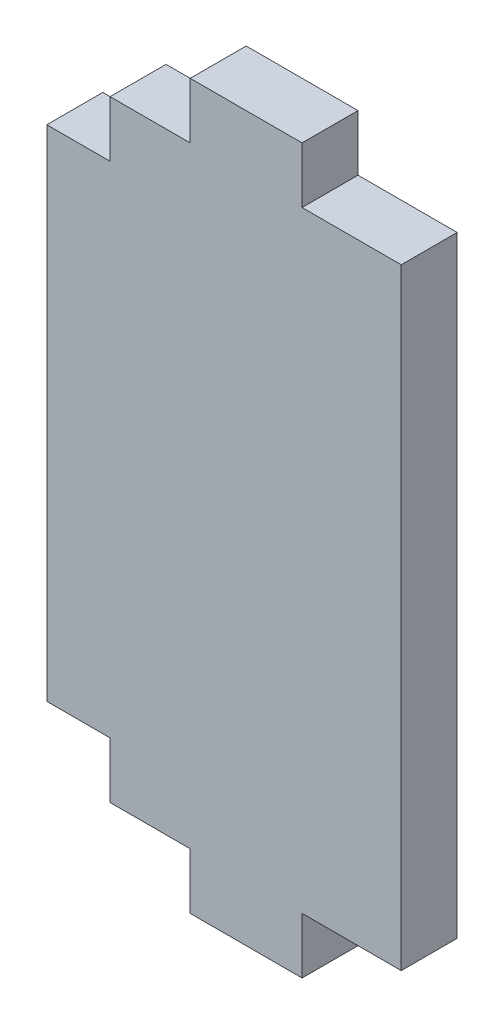
ISO-10303-21;
HEADER;
FILE_DESCRIPTION(('STEP AP214'),'2;1');
FILE_NAME('part.step','',(''),(''),'','','');
FILE_SCHEMA(('AUTOMOTIVE_DESIGN { 1 0 10303 214 1 1 1 1 }'));
ENDSEC;
DATA;
#1=APPLICATION_CONTEXT('core data for automotive mechanical design processes');
#2=APPLICATION_PROTOCOL_DEFINITION('international standard','automotive_design',2000,#1);
#3=PRODUCT_CONTEXT('',#1,'mechanical');
#4=PRODUCT('Part','Part','',(#3));
#5=PRODUCT_RELATED_PRODUCT_CATEGORY('part','',(#4));
#6=PRODUCT_DEFINITION_FORMATION('','',#4);
#7=PRODUCT_DEFINITION_CONTEXT('part definition',#1,'design');
#8=PRODUCT_DEFINITION('design','',#6,#7);
#9=PRODUCT_DEFINITION_SHAPE('','',#8);
#10=(LENGTH_UNIT() NAMED_UNIT(*) SI_UNIT(.MILLI.,.METRE.));
#11=(NAMED_UNIT(*) PLANE_ANGLE_UNIT() SI_UNIT($,.RADIAN.));
#12=(NAMED_UNIT(*) SI_UNIT($,.STERADIAN.) SOLID_ANGLE_UNIT());
#13=UNCERTAINTY_MEASURE_WITH_UNIT(LENGTH_MEASURE(1.E-05),#10,'distance_accuracy_value','');
#14=(GEOMETRIC_REPRESENTATION_CONTEXT(3) GLOBAL_UNCERTAINTY_ASSIGNED_CONTEXT((#13)) GLOBAL_UNIT_ASSIGNED_CONTEXT((#10,
#11,#12)) REPRESENTATION_CONTEXT('',''));
#15=CARTESIAN_POINT('',(0.,0.,0.));
#16=DIRECTION('',(0.,0.,1.));
#17=DIRECTION('',(1.,0.,0.));
#18=AXIS2_PLACEMENT_3D('',#15,#16,#17);
#19=CARTESIAN_POINT('',(-1241.1494371055,-48.5074859939811,3.00000000000005));
#20=DIRECTION('',(0.,-1.,0.));
#21=DIRECTION('',(0.,0.,-1.));
#22=AXIS2_PLACEMENT_3D('',#19,#20,#21);
#23=PLANE('',#22);
#24=DIRECTION('',(-1.,0.,0.));
#25=VECTOR('',#24,1.);
#26=CARTESIAN_POINT('',(-1241.14943710549,-48.5074859939811,1.04083408558608E-13));
#27=LINE('',#26,#25);
#28=CARTESIAN_POINT('',(-1235.83358525909,-48.5074859939811,1.04083408558608E-13));
#29=VERTEX_POINT('',#28);
#30=CARTESIAN_POINT('',(-1241.14943710549,-48.5074859939811,1.04083408558608E-13));
#31=VERTEX_POINT('',#30);
#32=EDGE_CURVE('E148',#29,#31,#27,.T.);
#33=ORIENTED_EDGE('',*,*,#32,.T.);
#34=DIRECTION('',(0.,0.,-1.));
#35=VECTOR('',#34,1.);
#36=CARTESIAN_POINT('',(-1241.1494371055,-48.5074859939811,3.00000000000005));
#37=LINE('',#36,#35);
#38=CARTESIAN_POINT('',(-1241.1494371055,-48.5074859939811,3.00000000000005));
#39=VERTEX_POINT('',#38);
#40=EDGE_CURVE('E11',#39,#31,#37,.T.);
#41=ORIENTED_EDGE('',*,*,#40,.F.);
#42=DIRECTION('',(-1.,0.,0.));
#43=VECTOR('',#42,1.);
#44=CARTESIAN_POINT('',(-1241.1494371055,-48.5074859939811,3.00000000000005));
#45=LINE('',#44,#43);
#46=CARTESIAN_POINT('',(-1235.83358525909,-48.5074859939812,3.0000000000001));
#47=VERTEX_POINT('',#46);
#48=EDGE_CURVE('E191',#47,#39,#45,.T.);
#49=ORIENTED_EDGE('',*,*,#48,.F.);
#50=DIRECTION('',(0.,0.,-1.));
#51=VECTOR('',#50,1.);
#52=CARTESIAN_POINT('',(-1235.83358525909,-48.5074859939812,3.0000000000001));
#53=LINE('',#52,#51);
#54=EDGE_CURVE('E161',#47,#29,#53,.T.);
#55=ORIENTED_EDGE('',*,*,#54,.T.);
#56=EDGE_LOOP('',(#33,#41,#49,#55));
#57=FACE_BOUND('',#56,.T.);
#58=ADVANCED_FACE('F32',(#57),#23,.F.);
#59=CARTESIAN_POINT('',(-1241.14943710549,-45.5074859939811,3.00000000000009));
#60=DIRECTION('',(-1.,0.,0.));
#61=DIRECTION('',(0.,0.,1.));
#62=AXIS2_PLACEMENT_3D('',#59,#60,#61);
#63=PLANE('',#62);
#64=DIRECTION('',(0.,1.,0.));
#65=VECTOR('',#64,1.);
#66=CARTESIAN_POINT('',(-1241.14943710549,-45.5074859939811,0.));
#67=LINE('',#66,#65);
#68=CARTESIAN_POINT('',(-1241.14943710549,-45.5074859939811,0.));
#69=VERTEX_POINT('',#68);
#70=EDGE_CURVE('E144',#31,#69,#67,.T.);
#71=ORIENTED_EDGE('',*,*,#70,.T.);
#72=DIRECTION('',(0.,0.,-1.));
#73=VECTOR('',#72,1.);
#74=CARTESIAN_POINT('',(-1241.14943710549,-45.5074859939811,3.00000000000009));
#75=LINE('',#74,#73);
#76=CARTESIAN_POINT('',(-1241.14943710549,-45.5074859939811,3.00000000000009));
#77=VERTEX_POINT('',#76);
#78=EDGE_CURVE('E39',#77,#69,#75,.T.);
#79=ORIENTED_EDGE('',*,*,#78,.F.);
#80=DIRECTION('',(0.,1.,0.));
#81=VECTOR('',#80,1.);
#82=CARTESIAN_POINT('',(-1241.14943710549,-45.5074859939811,3.00000000000009));
#83=LINE('',#82,#81);
#84=EDGE_CURVE('E157',#39,#77,#83,.T.);
#85=ORIENTED_EDGE('',*,*,#84,.F.);
#86=ORIENTED_EDGE('',*,*,#40,.T.);
#87=EDGE_LOOP('',(#71,#79,#85,#86));
#88=FACE_BOUND('',#87,.T.);
#89=ADVANCED_FACE('F156',(#88),#63,.F.);
#90=CARTESIAN_POINT('',(-1247.1453446838,-45.5074859939812,3.0000000000002));
#91=DIRECTION('',(0.,-1.,0.));
#92=DIRECTION('',(0.,0.,-1.));
#93=AXIS2_PLACEMENT_3D('',#90,#91,#92);
#94=PLANE('',#93);
#95=DIRECTION('',(-1.,0.,0.));
#96=VECTOR('',#95,1.);
#97=CARTESIAN_POINT('',(-1247.1453446838,-45.5074859939811,1.17961196366423E-13));
#98=LINE('',#97,#96);
#99=CARTESIAN_POINT('',(-1247.1453446838,-45.5074859939811,1.17961196366423E-13));
#100=VERTEX_POINT('',#99);
#101=EDGE_CURVE('E150',#69,#100,#98,.T.);
#102=ORIENTED_EDGE('',*,*,#101,.T.);
#103=DIRECTION('',(0.,0.,-1.));
#104=VECTOR('',#103,1.);
#105=CARTESIAN_POINT('',(-1247.1453446838,-45.5074859939812,3.0000000000002));
#106=LINE('',#105,#104);
#107=CARTESIAN_POINT('',(-1247.1453446838,-45.5074859939812,3.0000000000002));
#108=VERTEX_POINT('',#107);
#109=EDGE_CURVE('E257',#108,#100,#106,.T.);
#110=ORIENTED_EDGE('',*,*,#109,.F.);
#111=DIRECTION('',(-1.,0.,0.));
#112=VECTOR('',#111,1.);
#113=CARTESIAN_POINT('',(-1247.1453446838,-45.5074859939812,3.0000000000002));
#114=LINE('',#113,#112);
#115=EDGE_CURVE('E194',#77,#108,#114,.T.);
#116=ORIENTED_EDGE('',*,*,#115,.F.);
#117=ORIENTED_EDGE('',*,*,#78,.T.);
#118=EDGE_LOOP('',(#102,#110,#116,#117));
#119=FACE_BOUND('',#118,.T.);
#120=ADVANCED_FACE('F261',(#119),#94,.F.);
#121=CARTESIAN_POINT('',(-1247.1453446838,-48.5074859939812,3.00000000000015));
#122=DIRECTION('',(1.,0.,0.));
#123=DIRECTION('',(0.,0.,-1.));
#124=AXIS2_PLACEMENT_3D('',#121,#122,#123);
#125=PLANE('',#124);
#126=DIRECTION('',(0.,-1.,0.));
#127=VECTOR('',#126,1.);
#128=CARTESIAN_POINT('',(-1247.1453446838,-48.5074859939811,1.94289029309402E-13));
#129=LINE('',#128,#127);
#130=CARTESIAN_POINT('',(-1247.1453446838,-48.5074859939811,1.94289029309402E-13));
#131=VERTEX_POINT('',#130);
#132=EDGE_CURVE('E165',#100,#131,#129,.T.);
#133=ORIENTED_EDGE('',*,*,#132,.T.);
#134=DIRECTION('',(0.,0.,-1.));
#135=VECTOR('',#134,1.);
#136=CARTESIAN_POINT('',(-1247.1453446838,-48.5074859939812,3.00000000000015));
#137=LINE('',#136,#135);
#138=CARTESIAN_POINT('',(-1247.1453446838,-48.5074859939812,3.00000000000015));
#139=VERTEX_POINT('',#138);
#140=EDGE_CURVE('E254',#139,#131,#137,.T.);
#141=ORIENTED_EDGE('',*,*,#140,.F.);
#142=DIRECTION('',(0.,-1.,0.));
#143=VECTOR('',#142,1.);
#144=CARTESIAN_POINT('',(-1247.1453446838,-48.5074859939812,3.00000000000015));
#145=LINE('',#144,#143);
#146=EDGE_CURVE('E196',#108,#139,#145,.T.);
#147=ORIENTED_EDGE('',*,*,#146,.F.);
#148=ORIENTED_EDGE('',*,*,#109,.T.);
#149=EDGE_LOOP('',(#133,#141,#147,#148));
#150=FACE_BOUND('',#149,.T.);
#151=ADVANCED_FACE('F269',(#150),#125,.F.);
#152=CARTESIAN_POINT('',(-1251.44188848172,-48.5074859939809,3.00000000000002));
#153=DIRECTION('',(0.,-1.,0.));
#154=DIRECTION('',(0.,0.,-1.));
#155=AXIS2_PLACEMENT_3D('',#152,#153,#154);
#156=PLANE('',#155);
#157=DIRECTION('',(-1.,0.,0.));
#158=VECTOR('',#157,1.);
#159=CARTESIAN_POINT('',(-1251.44188848172,-48.5074859939811,0.));
#160=LINE('',#159,#158);
#161=CARTESIAN_POINT('',(-1251.44188848172,-48.5074859939811,0.));
#162=VERTEX_POINT('',#161);
#163=EDGE_CURVE('E167',#131,#162,#160,.T.);
#164=ORIENTED_EDGE('',*,*,#163,.T.);
#165=DIRECTION('',(0.,0.,-1.));
#166=VECTOR('',#165,1.);
#167=CARTESIAN_POINT('',(-1251.44188848172,-48.5074859939809,3.00000000000002));
#168=LINE('',#167,#166);
#169=CARTESIAN_POINT('',(-1251.44188848172,-48.5074859939809,3.00000000000002));
#170=VERTEX_POINT('',#169);
#171=EDGE_CURVE('E251',#170,#162,#168,.T.);
#172=ORIENTED_EDGE('',*,*,#171,.F.);
#173=DIRECTION('',(-1.,0.,0.));
#174=VECTOR('',#173,1.);
#175=CARTESIAN_POINT('',(-1251.44188848172,-48.5074859939809,3.00000000000002));
#176=LINE('',#175,#174);
#177=EDGE_CURVE('E198',#139,#170,#176,.T.);
#178=ORIENTED_EDGE('',*,*,#177,.F.);
#179=ORIENTED_EDGE('',*,*,#140,.T.);
#180=EDGE_LOOP('',(#164,#172,#178,#179));
#181=FACE_BOUND('',#180,.T.);
#182=ADVANCED_FACE('F272',(#181),#156,.F.);
#183=CARTESIAN_POINT('',(-1251.44188848172,-51.5074859939809,2.99999999999998));
#184=DIRECTION('',(1.,0.,0.));
#185=DIRECTION('',(0.,0.,-1.));
#186=AXIS2_PLACEMENT_3D('',#183,#184,#185);
#187=PLANE('',#186);
#188=DIRECTION('',(0.,-1.,0.));
#189=VECTOR('',#188,1.);
#190=CARTESIAN_POINT('',(-1251.44188848172,-51.5074859939811,0.));
#191=LINE('',#190,#189);
#192=CARTESIAN_POINT('',(-1251.44188848172,-51.5074859939811,0.));
#193=VERTEX_POINT('',#192);
#194=EDGE_CURVE('E169',#162,#193,#191,.T.);
#195=ORIENTED_EDGE('',*,*,#194,.T.);
#196=DIRECTION('',(0.,0.,-1.));
#197=VECTOR('',#196,1.);
#198=CARTESIAN_POINT('',(-1251.44188848172,-51.5074859939809,2.99999999999998));
#199=LINE('',#198,#197);
#200=CARTESIAN_POINT('',(-1251.44188848172,-51.5074859939809,2.99999999999998));
#201=VERTEX_POINT('',#200);
#202=EDGE_CURVE('E248',#201,#193,#199,.T.);
#203=ORIENTED_EDGE('',*,*,#202,.F.);
#204=DIRECTION('',(0.,-1.,0.));
#205=VECTOR('',#204,1.);
#206=CARTESIAN_POINT('',(-1251.44188848172,-51.5074859939809,2.99999999999998));
#207=LINE('',#206,#205);
#208=EDGE_CURVE('E200',#170,#201,#207,.T.);
#209=ORIENTED_EDGE('',*,*,#208,.F.);
#210=ORIENTED_EDGE('',*,*,#171,.T.);
#211=EDGE_LOOP('',(#195,#203,#209,#210));
#212=FACE_BOUND('',#211,.T.);
#213=ADVANCED_FACE('F277',(#212),#187,.F.);
#214=CARTESIAN_POINT('',(-1254.83358525909,-51.5074859939809,2.99999999999998));
#215=DIRECTION('',(0.,-1.,0.));
#216=DIRECTION('',(0.,0.,-1.));
#217=AXIS2_PLACEMENT_3D('',#214,#215,#216);
#218=PLANE('',#217);
#219=DIRECTION('',(-1.,0.,0.));
#220=VECTOR('',#219,1.);
#221=CARTESIAN_POINT('',(-1254.83358525909,-51.5074859939811,0.));
#222=LINE('',#221,#220);
#223=CARTESIAN_POINT('',(-1254.83358525909,-51.5074859939811,0.));
#224=VERTEX_POINT('',#223);
#225=EDGE_CURVE('E171',#193,#224,#222,.T.);
#226=ORIENTED_EDGE('',*,*,#225,.T.);
#227=DIRECTION('',(0.,0.,-1.));
#228=VECTOR('',#227,1.);
#229=CARTESIAN_POINT('',(-1254.83358525909,-51.5074859939809,2.99999999999998));
#230=LINE('',#229,#228);
#231=CARTESIAN_POINT('',(-1254.83358525909,-51.5074859939809,2.99999999999998));
#232=VERTEX_POINT('',#231);
#233=EDGE_CURVE('E245',#232,#224,#230,.T.);
#234=ORIENTED_EDGE('',*,*,#233,.F.);
#235=DIRECTION('',(-1.,0.,0.));
#236=VECTOR('',#235,1.);
#237=CARTESIAN_POINT('',(-1254.83358525909,-51.5074859939809,2.99999999999998));
#238=LINE('',#237,#236);
#239=EDGE_CURVE('E202',#201,#232,#238,.T.);
#240=ORIENTED_EDGE('',*,*,#239,.F.);
#241=ORIENTED_EDGE('',*,*,#202,.T.);
#242=EDGE_LOOP('',(#226,#234,#240,#241));
#243=FACE_BOUND('',#242,.T.);
#244=ADVANCED_FACE('F283',(#243),#218,.F.);
#245=CARTESIAN_POINT('',(-1254.83358525909,-78.2774859939809,2.99999999999999));
#246=DIRECTION('',(1.,0.,0.));
#247=DIRECTION('',(0.,0.,-1.));
#248=AXIS2_PLACEMENT_3D('',#245,#246,#247);
#249=PLANE('',#248);
#250=DIRECTION('',(0.,-1.,0.));
#251=VECTOR('',#250,1.);
#252=CARTESIAN_POINT('',(-1254.83358525909,-78.2774859939811,0.));
#253=LINE('',#252,#251);
#254=CARTESIAN_POINT('',(-1254.83358525909,-78.2774859939811,0.));
#255=VERTEX_POINT('',#254);
#256=EDGE_CURVE('E173',#224,#255,#253,.T.);
#257=ORIENTED_EDGE('',*,*,#256,.T.);
#258=DIRECTION('',(0.,0.,-1.));
#259=VECTOR('',#258,1.);
#260=CARTESIAN_POINT('',(-1254.83358525909,-78.2774859939809,2.99999999999999));
#261=LINE('',#260,#259);
#262=CARTESIAN_POINT('',(-1254.83358525909,-78.2774859939809,2.99999999999999));
#263=VERTEX_POINT('',#262);
#264=EDGE_CURVE('E242',#263,#255,#261,.T.);
#265=ORIENTED_EDGE('',*,*,#264,.F.);
#266=DIRECTION('',(0.,-1.,0.));
#267=VECTOR('',#266,1.);
#268=CARTESIAN_POINT('',(-1254.83358525909,-78.2774859939809,2.99999999999999));
#269=LINE('',#268,#267);
#270=EDGE_CURVE('E204',#232,#263,#269,.T.);
#271=ORIENTED_EDGE('',*,*,#270,.F.);
#272=ORIENTED_EDGE('',*,*,#233,.T.);
#273=EDGE_LOOP('',(#257,#265,#271,#272));
#274=FACE_BOUND('',#273,.T.);
#275=ADVANCED_FACE('F287',(#274),#249,.F.);
#276=CARTESIAN_POINT('',(-1254.83358525909,-78.2774859939809,2.99999999999999));
#277=DIRECTION('',(0.,1.,0.));
#278=DIRECTION('',(-1.,0.,0.));
#279=AXIS2_PLACEMENT_3D('',#276,#277,#278);
#280=PLANE('',#279);
#281=DIRECTION('',(1.,0.,0.));
#282=VECTOR('',#281,1.);
#283=CARTESIAN_POINT('',(-1254.83358525909,-78.2774859939811,0.));
#284=LINE('',#283,#282);
#285=CARTESIAN_POINT('',(-1251.44188848172,-78.2774859939811,0.));
#286=VERTEX_POINT('',#285);
#287=EDGE_CURVE('E175',#255,#286,#284,.T.);
#288=ORIENTED_EDGE('',*,*,#287,.T.);
#289=DIRECTION('',(0.,0.,-1.));
#290=VECTOR('',#289,1.);
#291=CARTESIAN_POINT('',(-1251.44188848172,-78.2774859939809,3.));
#292=LINE('',#291,#290);
#293=CARTESIAN_POINT('',(-1251.44188848172,-78.2774859939809,3.));
#294=VERTEX_POINT('',#293);
#295=EDGE_CURVE('E239',#294,#286,#292,.T.);
#296=ORIENTED_EDGE('',*,*,#295,.F.);
#297=DIRECTION('',(1.,0.,0.));
#298=VECTOR('',#297,1.);
#299=CARTESIAN_POINT('',(-1254.83358525909,-78.2774859939809,2.99999999999999));
#300=LINE('',#299,#298);
#301=EDGE_CURVE('E206',#263,#294,#300,.T.);
#302=ORIENTED_EDGE('',*,*,#301,.F.);
#303=ORIENTED_EDGE('',*,*,#264,.T.);
#304=EDGE_LOOP('',(#288,#296,#302,#303));
#305=FACE_BOUND('',#304,.T.);
#306=ADVANCED_FACE('F292',(#305),#280,.F.);
#307=CARTESIAN_POINT('',(-1251.44188848172,-78.2774859939809,3.));
#308=DIRECTION('',(1.,0.,0.));
#309=DIRECTION('',(0.,0.,-1.));
#310=AXIS2_PLACEMENT_3D('',#307,#308,#309);
#311=PLANE('',#310);
#312=DIRECTION('',(0.,-1.,0.));
#313=VECTOR('',#312,1.);
#314=CARTESIAN_POINT('',(-1251.44188848172,-78.2774859939811,0.));
#315=LINE('',#314,#313);
#316=CARTESIAN_POINT('',(-1251.44188848172,-81.277485993981,1.38777878078145E-13));
#317=VERTEX_POINT('',#316);
#318=EDGE_CURVE('E177',#286,#317,#315,.T.);
#319=ORIENTED_EDGE('',*,*,#318,.T.);
#320=DIRECTION('',(0.,0.,-1.));
#321=VECTOR('',#320,1.);
#322=CARTESIAN_POINT('',(-1251.44188848172,-81.2774859939809,3.00000000000002));
#323=LINE('',#322,#321);
#324=CARTESIAN_POINT('',(-1251.44188848172,-81.2774859939809,3.00000000000002));
#325=VERTEX_POINT('',#324);
#326=EDGE_CURVE('E236',#325,#317,#323,.T.);
#327=ORIENTED_EDGE('',*,*,#326,.F.);
#328=DIRECTION('',(0.,-1.,0.));
#329=VECTOR('',#328,1.);
#330=CARTESIAN_POINT('',(-1251.44188848172,-78.2774859939809,3.));
#331=LINE('',#330,#329);
#332=EDGE_CURVE('E208',#294,#325,#331,.T.);
#333=ORIENTED_EDGE('',*,*,#332,.F.);
#334=ORIENTED_EDGE('',*,*,#295,.T.);
#335=EDGE_LOOP('',(#319,#327,#333,#334));
#336=FACE_BOUND('',#335,.T.);
#337=ADVANCED_FACE('F298',(#336),#311,.F.);
#338=CARTESIAN_POINT('',(-1251.44188848172,-81.2774859939809,3.00000000000002));
#339=DIRECTION('',(0.,1.,0.));
#340=DIRECTION('',(0.,0.,1.));
#341=AXIS2_PLACEMENT_3D('',#338,#339,#340);
#342=PLANE('',#341);
#343=DIRECTION('',(1.,0.,0.));
#344=VECTOR('',#343,1.);
#345=CARTESIAN_POINT('',(-1251.44188848172,-81.277485993981,1.38777878078145E-13));
#346=LINE('',#345,#344);
#347=CARTESIAN_POINT('',(-1247.1453446838,-81.2774859939812,2.22044604925031E-13));
#348=VERTEX_POINT('',#347);
#349=EDGE_CURVE('E179',#317,#348,#346,.T.);
#350=ORIENTED_EDGE('',*,*,#349,.T.);
#351=DIRECTION('',(0.,0.,-1.));
#352=VECTOR('',#351,1.);
#353=CARTESIAN_POINT('',(-1247.1453446838,-81.2774859939811,3.00000000000011));
#354=LINE('',#353,#352);
#355=CARTESIAN_POINT('',(-1247.1453446838,-81.2774859939811,3.00000000000011));
#356=VERTEX_POINT('',#355);
#357=EDGE_CURVE('E233',#356,#348,#354,.T.);
#358=ORIENTED_EDGE('',*,*,#357,.F.);
#359=DIRECTION('',(1.,0.,0.));
#360=VECTOR('',#359,1.);
#361=CARTESIAN_POINT('',(-1251.44188848172,-81.2774859939809,3.00000000000002));
#362=LINE('',#361,#360);
#363=EDGE_CURVE('E210',#325,#356,#362,.T.);
#364=ORIENTED_EDGE('',*,*,#363,.F.);
#365=ORIENTED_EDGE('',*,*,#326,.T.);
#366=EDGE_LOOP('',(#350,#358,#364,#365));
#367=FACE_BOUND('',#366,.T.);
#368=ADVANCED_FACE('F302',(#367),#342,.F.);
#369=CARTESIAN_POINT('',(-1247.1453446838,-81.2774859939811,3.00000000000011));
#370=DIRECTION('',(1.,0.,0.));
#371=DIRECTION('',(0.,0.,-1.));
#372=AXIS2_PLACEMENT_3D('',#369,#370,#371);
#373=PLANE('',#372);
#374=DIRECTION('',(0.,-1.,0.));
#375=VECTOR('',#374,1.);
#376=CARTESIAN_POINT('',(-1247.1453446838,-81.2774859939812,2.22044604925031E-13));
#377=LINE('',#376,#375);
#378=CARTESIAN_POINT('',(-1247.1453446838,-84.2774859939812,1.66533453693773E-13));
#379=VERTEX_POINT('',#378);
#380=EDGE_CURVE('E181',#348,#379,#377,.T.);
#381=ORIENTED_EDGE('',*,*,#380,.T.);
#382=DIRECTION('',(0.,0.,-1.));
#383=VECTOR('',#382,1.);
#384=CARTESIAN_POINT('',(-1247.1453446838,-84.2774859939811,3.00000000000013));
#385=LINE('',#384,#383);
#386=CARTESIAN_POINT('',(-1247.1453446838,-84.2774859939811,3.00000000000013));
#387=VERTEX_POINT('',#386);
#388=EDGE_CURVE('E230',#387,#379,#385,.T.);
#389=ORIENTED_EDGE('',*,*,#388,.F.);
#390=DIRECTION('',(0.,-1.,0.));
#391=VECTOR('',#390,1.);
#392=CARTESIAN_POINT('',(-1247.1453446838,-81.2774859939811,3.00000000000011));
#393=LINE('',#392,#391);
#394=EDGE_CURVE('E212',#356,#387,#393,.T.);
#395=ORIENTED_EDGE('',*,*,#394,.F.);
#396=ORIENTED_EDGE('',*,*,#357,.T.);
#397=EDGE_LOOP('',(#381,#389,#395,#396));
#398=FACE_BOUND('',#397,.T.);
#399=ADVANCED_FACE('F307',(#398),#373,.F.);
#400=CARTESIAN_POINT('',(-1247.1453446838,-84.2774859939811,3.00000000000013));
#401=DIRECTION('',(0.,1.,0.));
#402=DIRECTION('',(0.,0.,1.));
#403=AXIS2_PLACEMENT_3D('',#400,#401,#402);
#404=PLANE('',#403);
#405=DIRECTION('',(1.,0.,0.));
#406=VECTOR('',#405,1.);
#407=CARTESIAN_POINT('',(-1247.1453446838,-84.2774859939812,1.66533453693773E-13));
#408=LINE('',#407,#406);
#409=CARTESIAN_POINT('',(-1241.14943710549,-84.2774859939811,1.45716771982052E-13));
#410=VERTEX_POINT('',#409);
#411=EDGE_CURVE('E183',#379,#410,#408,.T.);
#412=ORIENTED_EDGE('',*,*,#411,.T.);
#413=DIRECTION('',(0.,0.,-1.));
#414=VECTOR('',#413,1.);
#415=CARTESIAN_POINT('',(-1241.1494371055,-84.2774859939811,3.0000000000001));
#416=LINE('',#415,#414);
#417=CARTESIAN_POINT('',(-1241.1494371055,-84.2774859939811,3.0000000000001));
#418=VERTEX_POINT('',#417);
#419=EDGE_CURVE('E227',#418,#410,#416,.T.);
#420=ORIENTED_EDGE('',*,*,#419,.F.);
#421=DIRECTION('',(1.,0.,0.));
#422=VECTOR('',#421,1.);
#423=CARTESIAN_POINT('',(-1247.1453446838,-84.2774859939811,3.00000000000013));
#424=LINE('',#423,#422);
#425=EDGE_CURVE('E214',#387,#418,#424,.T.);
#426=ORIENTED_EDGE('',*,*,#425,.F.);
#427=ORIENTED_EDGE('',*,*,#388,.T.);
#428=EDGE_LOOP('',(#412,#420,#426,#427));
#429=FACE_BOUND('',#428,.T.);
#430=ADVANCED_FACE('F313',(#429),#404,.F.);
#431=CARTESIAN_POINT('',(-1241.1494371055,-84.2774859939811,3.0000000000001));
#432=DIRECTION('',(-1.,0.,0.));
#433=DIRECTION('',(0.,0.,1.));
#434=AXIS2_PLACEMENT_3D('',#431,#432,#433);
#435=PLANE('',#434);
#436=DIRECTION('',(0.,1.,0.));
#437=VECTOR('',#436,1.);
#438=CARTESIAN_POINT('',(-1241.14943710549,-84.2774859939811,1.45716771982052E-13));
#439=LINE('',#438,#437);
#440=CARTESIAN_POINT('',(-1241.14943710549,-81.2774859939812,0.));
#441=VERTEX_POINT('',#440);
#442=EDGE_CURVE('E185',#410,#441,#439,.T.);
#443=ORIENTED_EDGE('',*,*,#442,.T.);
#444=DIRECTION('',(0.,0.,-1.));
#445=VECTOR('',#444,1.);
#446=CARTESIAN_POINT('',(-1241.1494371055,-81.2774859939811,3.00000000000008));
#447=LINE('',#446,#445);
#448=CARTESIAN_POINT('',(-1241.1494371055,-81.2774859939811,3.00000000000008));
#449=VERTEX_POINT('',#448);
#450=EDGE_CURVE('E224',#449,#441,#447,.T.);
#451=ORIENTED_EDGE('',*,*,#450,.F.);
#452=DIRECTION('',(0.,1.,0.));
#453=VECTOR('',#452,1.);
#454=CARTESIAN_POINT('',(-1241.1494371055,-84.2774859939811,3.0000000000001));
#455=LINE('',#454,#453);
#456=EDGE_CURVE('E216',#418,#449,#455,.T.);
#457=ORIENTED_EDGE('',*,*,#456,.F.);
#458=ORIENTED_EDGE('',*,*,#419,.T.);
#459=EDGE_LOOP('',(#443,#451,#457,#458));
#460=FACE_BOUND('',#459,.T.);
#461=ADVANCED_FACE('F317',(#460),#435,.F.);
#462=CARTESIAN_POINT('',(-1241.1494371055,-81.2774859939811,3.00000000000008));
#463=DIRECTION('',(0.,1.,0.));
#464=DIRECTION('',(0.,0.,1.));
#465=AXIS2_PLACEMENT_3D('',#462,#463,#464);
#466=PLANE('',#465);
#467=DIRECTION('',(1.,0.,0.));
#468=VECTOR('',#467,1.);
#469=CARTESIAN_POINT('',(-1241.14943710549,-81.2774859939812,0.));
#470=LINE('',#469,#468);
#471=CARTESIAN_POINT('',(-1235.83358525909,-81.2774859939812,0.));
#472=VERTEX_POINT('',#471);
#473=EDGE_CURVE('E187',#441,#472,#470,.T.);
#474=ORIENTED_EDGE('',*,*,#473,.T.);
#475=DIRECTION('',(0.,0.,-1.));
#476=VECTOR('',#475,1.);
#477=CARTESIAN_POINT('',(-1235.83358525909,-81.2774859939812,3.00000000000011));
#478=LINE('',#477,#476);
#479=CARTESIAN_POINT('',(-1235.83358525909,-81.2774859939812,3.00000000000011));
#480=VERTEX_POINT('',#479);
#481=EDGE_CURVE('E221',#480,#472,#478,.T.);
#482=ORIENTED_EDGE('',*,*,#481,.F.);
#483=DIRECTION('',(1.,0.,0.));
#484=VECTOR('',#483,1.);
#485=CARTESIAN_POINT('',(-1241.1494371055,-81.2774859939811,3.00000000000008));
#486=LINE('',#485,#484);
#487=EDGE_CURVE('E51',#449,#480,#486,.T.);
#488=ORIENTED_EDGE('',*,*,#487,.F.);
#489=ORIENTED_EDGE('',*,*,#450,.T.);
#490=EDGE_LOOP('',(#474,#482,#488,#489));
#491=FACE_BOUND('',#490,.T.);
#492=ADVANCED_FACE('F320',(#491),#466,.F.);
#493=CARTESIAN_POINT('',(-1235.83358525909,-48.5074859939812,3.0000000000001));
#494=DIRECTION('',(-1.,0.,0.));
#495=DIRECTION('',(0.,0.,1.));
#496=AXIS2_PLACEMENT_3D('',#493,#494,#495);
#497=PLANE('',#496);
#498=DIRECTION('',(0.,1.,0.));
#499=VECTOR('',#498,1.);
#500=CARTESIAN_POINT('',(-1235.83358525909,-48.5074859939811,1.04083408558608E-13));
#501=LINE('',#500,#499);
#502=EDGE_CURVE('E189',#472,#29,#501,.T.);
#503=ORIENTED_EDGE('',*,*,#502,.T.);
#504=ORIENTED_EDGE('',*,*,#54,.F.);
#505=DIRECTION('',(0.,1.,0.));
#506=VECTOR('',#505,1.);
#507=CARTESIAN_POINT('',(-1235.83358525909,-48.5074859939812,3.0000000000001));
#508=LINE('',#507,#506);
#509=EDGE_CURVE('E46',#480,#47,#508,.T.);
#510=ORIENTED_EDGE('',*,*,#509,.F.);
#511=ORIENTED_EDGE('',*,*,#481,.T.);
#512=EDGE_LOOP('',(#503,#504,#510,#511));
#513=FACE_BOUND('',#512,.T.);
#514=ADVANCED_FACE('F322',(#513),#497,.F.);
#515=CARTESIAN_POINT('',(-1235.83358525909,-48.5074859939812,3.0000000000001));
#516=DIRECTION('',(0.,0.,-1.));
#517=DIRECTION('',(-1.,0.,0.));
#518=AXIS2_PLACEMENT_3D('',#515,#516,#517);
#519=PLANE('',#518);
#520=ORIENTED_EDGE('',*,*,#48,.T.);
#521=ORIENTED_EDGE('',*,*,#84,.T.);
#522=ORIENTED_EDGE('',*,*,#115,.T.);
#523=ORIENTED_EDGE('',*,*,#146,.T.);
#524=ORIENTED_EDGE('',*,*,#177,.T.);
#525=ORIENTED_EDGE('',*,*,#208,.T.);
#526=ORIENTED_EDGE('',*,*,#239,.T.);
#527=ORIENTED_EDGE('',*,*,#270,.T.);
#528=ORIENTED_EDGE('',*,*,#301,.T.);
#529=ORIENTED_EDGE('',*,*,#332,.T.);
#530=ORIENTED_EDGE('',*,*,#363,.T.);
#531=ORIENTED_EDGE('',*,*,#394,.T.);
#532=ORIENTED_EDGE('',*,*,#425,.T.);
#533=ORIENTED_EDGE('',*,*,#456,.T.);
#534=ORIENTED_EDGE('',*,*,#487,.T.);
#535=ORIENTED_EDGE('',*,*,#509,.T.);
#536=EDGE_LOOP('',(#520,#521,#522,#523,#524,#525,#526,#527,#528,#529,#530,#531,#532,#533,#534,#535));
#537=FACE_BOUND('',#536,.T.);
#538=ADVANCED_FACE('F264',(#537),#519,.F.);
#539=CARTESIAN_POINT('',(-1235.83358525909,-48.5074859939811,1.04083408558608E-13));
#540=DIRECTION('',(0.,0.,-1.));
#541=DIRECTION('',(-1.,0.,0.));
#542=AXIS2_PLACEMENT_3D('',#539,#540,#541);
#543=PLANE('',#542);
#544=ORIENTED_EDGE('',*,*,#32,.F.);
#545=ORIENTED_EDGE('',*,*,#502,.F.);
#546=ORIENTED_EDGE('',*,*,#473,.F.);
#547=ORIENTED_EDGE('',*,*,#442,.F.);
#548=ORIENTED_EDGE('',*,*,#411,.F.);
#549=ORIENTED_EDGE('',*,*,#380,.F.);
#550=ORIENTED_EDGE('',*,*,#349,.F.);
#551=ORIENTED_EDGE('',*,*,#318,.F.);
#552=ORIENTED_EDGE('',*,*,#287,.F.);
#553=ORIENTED_EDGE('',*,*,#256,.F.);
#554=ORIENTED_EDGE('',*,*,#225,.F.);
#555=ORIENTED_EDGE('',*,*,#194,.F.);
#556=ORIENTED_EDGE('',*,*,#163,.F.);
#557=ORIENTED_EDGE('',*,*,#132,.F.);
#558=ORIENTED_EDGE('',*,*,#101,.F.);
#559=ORIENTED_EDGE('',*,*,#70,.F.);
#560=EDGE_LOOP('',(#544,#545,#546,#547,#548,#549,#550,#551,#552,#553,#554,#555,#556,#557,#558,#559));
#561=FACE_BOUND('',#560,.T.);
#562=ADVANCED_FACE('F145',(#561),#543,.T.);
#563=CLOSED_SHELL('',(#58,#89,#120,#151,#182,#213,#244,#275,#306,#337,#368,#399,#430,#461,#492,
#514,#538,#562));
#564=MANIFOLD_SOLID_BREP('B2',#563);
#565=ADVANCED_BREP_SHAPE_REPRESENTATION('',(#18,#564),#14);
#566=SHAPE_DEFINITION_REPRESENTATION(#9,#565);
ENDSEC;
END-ISO-10303-21;
